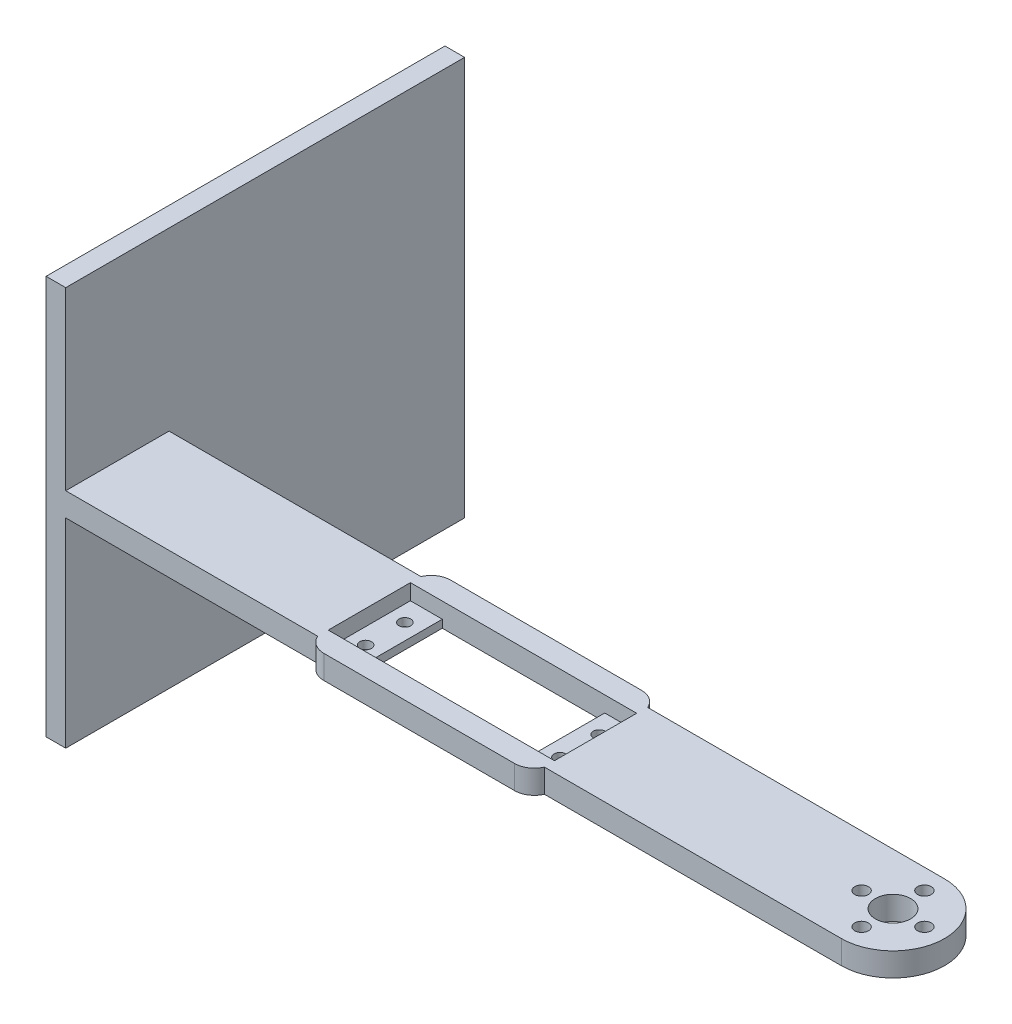
ISO-10303-21;
HEADER;
FILE_DESCRIPTION(('STEP AP214'),'2;1');
FILE_NAME('part.step','',(''),(''),'','','');
FILE_SCHEMA(('AUTOMOTIVE_DESIGN { 1 0 10303 214 1 1 1 1 }'));
ENDSEC;
DATA;
#1=APPLICATION_CONTEXT('core data for automotive mechanical design processes');
#2=APPLICATION_PROTOCOL_DEFINITION('international standard','automotive_design',2000,#1);
#3=PRODUCT_CONTEXT('',#1,'mechanical');
#4=PRODUCT('Part','Part','',(#3));
#5=PRODUCT_RELATED_PRODUCT_CATEGORY('part','',(#4));
#6=PRODUCT_DEFINITION_FORMATION('','',#4);
#7=PRODUCT_DEFINITION_CONTEXT('part definition',#1,'design');
#8=PRODUCT_DEFINITION('design','',#6,#7);
#9=PRODUCT_DEFINITION_SHAPE('','',#8);
#10=(LENGTH_UNIT() NAMED_UNIT(*) SI_UNIT(.MILLI.,.METRE.));
#11=(NAMED_UNIT(*) PLANE_ANGLE_UNIT() SI_UNIT($,.RADIAN.));
#12=(NAMED_UNIT(*) SI_UNIT($,.STERADIAN.) SOLID_ANGLE_UNIT());
#13=UNCERTAINTY_MEASURE_WITH_UNIT(LENGTH_MEASURE(1.E-05),#10,'distance_accuracy_value','');
#14=(GEOMETRIC_REPRESENTATION_CONTEXT(3) GLOBAL_UNCERTAINTY_ASSIGNED_CONTEXT((#13)) GLOBAL_UNIT_ASSIGNED_CONTEXT((#10,
#11,#12)) REPRESENTATION_CONTEXT('',''));
#15=CARTESIAN_POINT('',(0.,0.,0.));
#16=DIRECTION('',(0.,0.,1.));
#17=DIRECTION('',(1.,0.,0.));
#18=AXIS2_PLACEMENT_3D('',#15,#16,#17);
#19=CARTESIAN_POINT('',(0.,6.,-13.1543728715168));
#20=DIRECTION('',(0.,0.,1.));
#21=DIRECTION('',(1.,0.,0.));
#22=AXIS2_PLACEMENT_3D('',#19,#20,#21);
#23=PLANE('',#22);
#24=DIRECTION('',(-1.,0.,0.));
#25=VECTOR('',#24,1.);
#26=CARTESIAN_POINT('',(0.,0.,-13.1543728715168));
#27=LINE('',#26,#25);
#28=CARTESIAN_POINT('',(0.,0.,-13.1543728715169));
#29=VERTEX_POINT('',#28);
#30=CARTESIAN_POINT('',(-75.635048604056,0.,-13.1543728715168));
#31=VERTEX_POINT('',#30);
#32=EDGE_CURVE('E208',#29,#31,#27,.T.);
#33=ORIENTED_EDGE('',*,*,#32,.T.);
#34=DIRECTION('',(0.,1.,0.));
#35=VECTOR('',#34,1.);
#36=CARTESIAN_POINT('',(-75.635048604056,0.,-13.1543728715168));
#37=LINE('',#36,#35);
#38=CARTESIAN_POINT('',(-75.635048604056,6.,-13.1543728715168));
#39=VERTEX_POINT('',#38);
#40=EDGE_CURVE('E215',#31,#39,#37,.T.);
#41=ORIENTED_EDGE('',*,*,#40,.T.);
#42=DIRECTION('',(-1.,0.,0.));
#43=VECTOR('',#42,1.);
#44=CARTESIAN_POINT('',(0.,6.,-13.1543728715168));
#45=LINE('',#44,#43);
#46=CARTESIAN_POINT('',(0.,6.,-13.1543728715169));
#47=VERTEX_POINT('',#46);
#48=EDGE_CURVE('E338',#47,#39,#45,.T.);
#49=ORIENTED_EDGE('',*,*,#48,.F.);
#50=DIRECTION('',(0.,-1.,0.));
#51=VECTOR('',#50,1.);
#52=CARTESIAN_POINT('',(0.,6.,-13.1543728715169));
#53=LINE('',#52,#51);
#54=EDGE_CURVE('E400',#47,#29,#53,.T.);
#55=ORIENTED_EDGE('',*,*,#54,.T.);
#56=EDGE_LOOP('',(#33,#41,#49,#55));
#57=FACE_BOUND('',#56,.T.);
#58=ADVANCED_FACE('F35',(#57),#23,.F.);
#59=CARTESIAN_POINT('',(0.,6.,13.1543728715168));
#60=DIRECTION('',(0.,0.,1.));
#61=DIRECTION('',(1.,0.,0.));
#62=AXIS2_PLACEMENT_3D('',#59,#60,#61);
#63=PLANE('',#62);
#64=DIRECTION('',(-1.,0.,0.));
#65=VECTOR('',#64,1.);
#66=CARTESIAN_POINT('',(0.,6.,13.1543728715168));
#67=LINE('',#66,#65);
#68=CARTESIAN_POINT('',(-133.384001977959,6.,13.1543728715168));
#69=VERTEX_POINT('',#68);
#70=CARTESIAN_POINT('',(-197.55630843939,6.,13.1543728715169));
#71=VERTEX_POINT('',#70);
#72=EDGE_CURVE('E344',#69,#71,#67,.T.);
#73=ORIENTED_EDGE('',*,*,#72,.T.);
#74=DIRECTION('',(0.,1.,0.));
#75=VECTOR('',#74,1.);
#76=CARTESIAN_POINT('',(-197.55630843939,-50.8,13.1543728715169));
#77=LINE('',#76,#75);
#78=CARTESIAN_POINT('',(-197.55630843939,50.8,13.1543728715169));
#79=VERTEX_POINT('',#78);
#80=EDGE_CURVE('E283',#71,#79,#77,.T.);
#81=ORIENTED_EDGE('',*,*,#80,.T.);
#82=DIRECTION('',(-1.,0.,0.));
#83=VECTOR('',#82,1.);
#84=CARTESIAN_POINT('',(0.,50.8,13.1543728715168));
#85=LINE('',#84,#83);
#86=CARTESIAN_POINT('',(-202.55630843939,50.8,13.1543728715169));
#87=VERTEX_POINT('',#86);
#88=EDGE_CURVE('E261',#79,#87,#85,.T.);
#89=ORIENTED_EDGE('',*,*,#88,.T.);
#90=DIRECTION('',(0.,1.,0.));
#91=VECTOR('',#90,1.);
#92=CARTESIAN_POINT('',(-202.55630843939,-50.8,13.1543728715169));
#93=LINE('',#92,#91);
#94=CARTESIAN_POINT('',(-202.55630843939,-50.8,13.1543728715169));
#95=VERTEX_POINT('',#94);
#96=EDGE_CURVE('E284',#95,#87,#93,.T.);
#97=ORIENTED_EDGE('',*,*,#96,.F.);
#98=DIRECTION('',(-1.,0.,0.));
#99=VECTOR('',#98,1.);
#100=CARTESIAN_POINT('',(0.,-50.8,13.1543728715168));
#101=LINE('',#100,#99);
#102=CARTESIAN_POINT('',(-197.55630843939,-50.8,13.1543728715169));
#103=VERTEX_POINT('',#102);
#104=EDGE_CURVE('E271',#103,#95,#101,.T.);
#105=ORIENTED_EDGE('',*,*,#104,.F.);
#106=CARTESIAN_POINT('',(-197.55630843939,0.,13.1543728715169));
#107=VERTEX_POINT('',#106);
#108=EDGE_CURVE('E280',#103,#107,#77,.T.);
#109=ORIENTED_EDGE('',*,*,#108,.T.);
#110=DIRECTION('',(-1.,0.,0.));
#111=VECTOR('',#110,1.);
#112=CARTESIAN_POINT('',(0.,0.,13.1543728715168));
#113=LINE('',#112,#111);
#114=CARTESIAN_POINT('',(-133.384001977959,0.,13.1543728715169));
#115=VERTEX_POINT('',#114);
#116=EDGE_CURVE('E375',#115,#107,#113,.T.);
#117=ORIENTED_EDGE('',*,*,#116,.F.);
#118=DIRECTION('',(0.,-1.,0.));
#119=VECTOR('',#118,1.);
#120=CARTESIAN_POINT('',(-133.384001977959,0.,13.1543728715168));
#121=LINE('',#120,#119);
#122=EDGE_CURVE('E243',#69,#115,#121,.T.);
#123=ORIENTED_EDGE('',*,*,#122,.F.);
#124=EDGE_LOOP('',(#73,#81,#89,#97,#105,#109,#117,#123));
#125=FACE_BOUND('',#124,.T.);
#126=ADVANCED_FACE('F461',(#125),#63,.T.);
#127=CARTESIAN_POINT('',(0.,6.,13.1543728715169));
#128=VERTEX_POINT('',#127);
#129=CARTESIAN_POINT('',(-75.635048604056,6.,13.1543728715168));
#130=VERTEX_POINT('',#129);
#131=EDGE_CURVE('E345',#128,#130,#67,.T.);
#132=ORIENTED_EDGE('',*,*,#131,.T.);
#133=DIRECTION('',(0.,1.,0.));
#134=VECTOR('',#133,1.);
#135=CARTESIAN_POINT('',(-75.635048604056,0.,13.1543728715168));
#136=LINE('',#135,#134);
#137=CARTESIAN_POINT('',(-75.635048604056,0.,13.1543728715168));
#138=VERTEX_POINT('',#137);
#139=EDGE_CURVE('E248',#138,#130,#136,.T.);
#140=ORIENTED_EDGE('',*,*,#139,.F.);
#141=CARTESIAN_POINT('',(0.,0.,13.1543728715169));
#142=VERTEX_POINT('',#141);
#143=EDGE_CURVE('E376',#142,#138,#113,.T.);
#144=ORIENTED_EDGE('',*,*,#143,.F.);
#145=DIRECTION('',(0.,-1.,0.));
#146=VECTOR('',#145,1.);
#147=CARTESIAN_POINT('',(0.,6.,13.1543728715169));
#148=LINE('',#147,#146);
#149=EDGE_CURVE('E370',#128,#142,#148,.T.);
#150=ORIENTED_EDGE('',*,*,#149,.F.);
#151=EDGE_LOOP('',(#132,#140,#144,#150));
#152=FACE_BOUND('',#151,.T.);
#153=ADVANCED_FACE('F445',(#152),#63,.T.);
#154=CARTESIAN_POINT('',(0.,6.,-10.466498315129));
#155=DIRECTION('',(0.,0.,-1.));
#156=DIRECTION('',(-1.,0.,0.));
#157=AXIS2_PLACEMENT_3D('',#154,#155,#156);
#158=PLANE('',#157);
#159=DIRECTION('',(1.,0.,0.));
#160=VECTOR('',#159,1.);
#161=CARTESIAN_POINT('',(0.,0.,-10.466498315129));
#162=LINE('',#161,#160);
#163=CARTESIAN_POINT('',(-125.256924736469,0.,-10.4664983151292));
#164=VERTEX_POINT('',#163);
#165=CARTESIAN_POINT('',(-83.8865174044968,0.,-10.4664983151291));
#166=VERTEX_POINT('',#165);
#167=EDGE_CURVE('E379',#164,#166,#162,.T.);
#168=ORIENTED_EDGE('',*,*,#167,.T.);
#169=DIRECTION('',(0.,-1.,0.));
#170=VECTOR('',#169,1.);
#171=CARTESIAN_POINT('',(-83.8865174044968,2.,-10.4664983151291));
#172=LINE('',#171,#170);
#173=CARTESIAN_POINT('',(-83.8865174044968,2.,-10.4664983151291));
#174=VERTEX_POINT('',#173);
#175=EDGE_CURVE('E301',#174,#166,#172,.T.);
#176=ORIENTED_EDGE('',*,*,#175,.F.);
#177=DIRECTION('',(1.,0.,0.));
#178=VECTOR('',#177,1.);
#179=CARTESIAN_POINT('',(0.,2.,-10.466498315129));
#180=LINE('',#179,#178);
#181=CARTESIAN_POINT('',(-75.7569247364686,2.,-10.4664983151291));
#182=VERTEX_POINT('',#181);
#183=EDGE_CURVE('E296',#174,#182,#180,.T.);
#184=ORIENTED_EDGE('',*,*,#183,.T.);
#185=DIRECTION('',(0.,-1.,0.));
#186=VECTOR('',#185,1.);
#187=CARTESIAN_POINT('',(-75.7569247364686,6.,-10.4664983151291));
#188=LINE('',#187,#186);
#189=CARTESIAN_POINT('',(-75.7569247364686,6.,-10.4664983151291));
#190=VERTEX_POINT('',#189);
#191=EDGE_CURVE('E399',#190,#182,#188,.T.);
#192=ORIENTED_EDGE('',*,*,#191,.F.);
#193=DIRECTION('',(1.,0.,0.));
#194=VECTOR('',#193,1.);
#195=CARTESIAN_POINT('',(0.,6.,-10.466498315129));
#196=LINE('',#195,#194);
#197=CARTESIAN_POINT('',(-133.386517404497,6.,-10.4664983151291));
#198=VERTEX_POINT('',#197);
#199=EDGE_CURVE('E348',#198,#190,#196,.T.);
#200=ORIENTED_EDGE('',*,*,#199,.F.);
#201=DIRECTION('',(0.,-1.,0.));
#202=VECTOR('',#201,1.);
#203=CARTESIAN_POINT('',(-133.386517404497,6.,-10.4664983151291));
#204=LINE('',#203,#202);
#205=CARTESIAN_POINT('',(-133.386517404497,2.,-10.4664983151291));
#206=VERTEX_POINT('',#205);
#207=EDGE_CURVE('E396',#198,#206,#204,.T.);
#208=ORIENTED_EDGE('',*,*,#207,.T.);
#209=DIRECTION('',(-1.,0.,0.));
#210=VECTOR('',#209,1.);
#211=CARTESIAN_POINT('',(0.,2.,-10.4664983151293));
#212=LINE('',#211,#210);
#213=CARTESIAN_POINT('',(-125.256924736469,2.,-10.4664983151292));
#214=VERTEX_POINT('',#213);
#215=EDGE_CURVE('E320',#214,#206,#212,.T.);
#216=ORIENTED_EDGE('',*,*,#215,.F.);
#217=DIRECTION('',(0.,-1.,0.));
#218=VECTOR('',#217,1.);
#219=CARTESIAN_POINT('',(-125.256924736469,2.,-10.4664983151291));
#220=LINE('',#219,#218);
#221=EDGE_CURVE('E325',#214,#164,#220,.T.);
#222=ORIENTED_EDGE('',*,*,#221,.T.);
#223=EDGE_LOOP('',(#168,#176,#184,#192,#200,#208,#216,#222));
#224=FACE_BOUND('',#223,.T.);
#225=ADVANCED_FACE('F520',(#224),#158,.F.);
#226=CARTESIAN_POINT('',(-75.7569247364686,6.,0.));
#227=DIRECTION('',(-1.,0.,0.));
#228=DIRECTION('',(0.,0.,1.));
#229=AXIS2_PLACEMENT_3D('',#226,#227,#228);
#230=PLANE('',#229);
#231=DIRECTION('',(0.,-1.,0.));
#232=VECTOR('',#231,1.);
#233=CARTESIAN_POINT('',(-75.7569247364686,6.,10.4664983151291));
#234=LINE('',#233,#232);
#235=CARTESIAN_POINT('',(-75.7569247364686,6.,10.4664983151291));
#236=VERTEX_POINT('',#235);
#237=CARTESIAN_POINT('',(-75.7569247364686,2.,10.4664983151291));
#238=VERTEX_POINT('',#237);
#239=EDGE_CURVE('E227',#236,#238,#234,.T.);
#240=ORIENTED_EDGE('',*,*,#239,.F.);
#241=DIRECTION('',(0.,0.,-1.));
#242=VECTOR('',#241,1.);
#243=CARTESIAN_POINT('',(-75.7569247364686,6.,0.));
#244=LINE('',#243,#242);
#245=EDGE_CURVE('E351',#236,#190,#244,.T.);
#246=ORIENTED_EDGE('',*,*,#245,.T.);
#247=ORIENTED_EDGE('',*,*,#191,.T.);
#248=DIRECTION('',(0.,0.,-1.));
#249=VECTOR('',#248,1.);
#250=CARTESIAN_POINT('',(-75.7569247364686,2.,0.));
#251=LINE('',#250,#249);
#252=EDGE_CURVE('E294',#238,#182,#251,.T.);
#253=ORIENTED_EDGE('',*,*,#252,.F.);
#254=EDGE_LOOP('',(#240,#246,#247,#253));
#255=FACE_BOUND('',#254,.T.);
#256=ADVANCED_FACE('F516',(#255),#230,.T.);
#257=CARTESIAN_POINT('',(0.,6.,0.));
#258=DIRECTION('',(0.,-1.,0.));
#259=DIRECTION('',(0.,0.,-1.));
#260=AXIS2_PLACEMENT_3D('',#257,#258,#259);
#261=CYLINDRICAL_SURFACE('',#260,13.1543728715169);
#262=CARTESIAN_POINT('',(0.,0.,0.));
#263=DIRECTION('',(0.,1.,0.));
#264=DIRECTION('',(0.,0.,1.));
#265=AXIS2_PLACEMENT_3D('',#262,#263,#264);
#266=CIRCLE('',#265,13.1543728715169);
#267=EDGE_CURVE('E209',#142,#29,#266,.T.);
#268=ORIENTED_EDGE('',*,*,#267,.T.);
#269=ORIENTED_EDGE('',*,*,#54,.F.);
#270=CARTESIAN_POINT('',(0.,6.,0.));
#271=DIRECTION('',(0.,1.,0.));
#272=DIRECTION('',(0.,0.,1.));
#273=AXIS2_PLACEMENT_3D('',#270,#271,#272);
#274=CIRCLE('',#273,13.1543728715169);
#275=EDGE_CURVE('E334',#128,#47,#274,.T.);
#276=ORIENTED_EDGE('',*,*,#275,.F.);
#277=ORIENTED_EDGE('',*,*,#149,.T.);
#278=EDGE_LOOP('',(#268,#269,#276,#277));
#279=FACE_BOUND('',#278,.T.);
#280=ADVANCED_FACE('F506',(#279),#261,.T.);
#281=CARTESIAN_POINT('',(-133.384001977959,6.,-13.1543728715168));
#282=VERTEX_POINT('',#281);
#283=CARTESIAN_POINT('',(-197.55630843939,6.,-13.1543728715168));
#284=VERTEX_POINT('',#283);
#285=EDGE_CURVE('E213',#282,#284,#45,.T.);
#286=ORIENTED_EDGE('',*,*,#285,.F.);
#287=DIRECTION('',(0.,-1.,0.));
#288=VECTOR('',#287,1.);
#289=CARTESIAN_POINT('',(-133.384001977959,0.,-13.1543728715168));
#290=LINE('',#289,#288);
#291=CARTESIAN_POINT('',(-133.384001977959,0.,-13.1543728715168));
#292=VERTEX_POINT('',#291);
#293=EDGE_CURVE('E197',#282,#292,#290,.T.);
#294=ORIENTED_EDGE('',*,*,#293,.T.);
#295=CARTESIAN_POINT('',(-197.55630843939,0.,-13.1543728715168));
#296=VERTEX_POINT('',#295);
#297=EDGE_CURVE('E200',#292,#296,#27,.T.);
#298=ORIENTED_EDGE('',*,*,#297,.T.);
#299=DIRECTION('',(0.,-1.,0.));
#300=VECTOR('',#299,1.);
#301=CARTESIAN_POINT('',(-197.55630843939,6.,-13.1543728715168));
#302=LINE('',#301,#300);
#303=EDGE_CURVE('E405',#284,#296,#302,.T.);
#304=ORIENTED_EDGE('',*,*,#303,.F.);
#305=EDGE_LOOP('',(#286,#294,#298,#304));
#306=FACE_BOUND('',#305,.T.);
#307=ADVANCED_FACE('F212',(#306),#23,.F.);
#308=CARTESIAN_POINT('',(0.,6.,-8.));
#309=DIRECTION('',(0.,-1.,0.));
#310=DIRECTION('',(0.,0.,-1.));
#311=AXIS2_PLACEMENT_3D('',#308,#309,#310);
#312=CYLINDRICAL_SURFACE('',#311,1.75);
#313=CARTESIAN_POINT('',(0.,6.,-8.));
#314=DIRECTION('',(0.,1.,0.));
#315=DIRECTION('',(0.,0.,1.));
#316=AXIS2_PLACEMENT_3D('',#313,#314,#315);
#317=CIRCLE('',#316,1.75);
#318=CARTESIAN_POINT('',(0.,6.,-6.25));
#319=VERTEX_POINT('',#318);
#320=EDGE_CURVE('E364',#319,#319,#317,.T.);
#321=ORIENTED_EDGE('',*,*,#320,.T.);
#322=EDGE_LOOP('',(#321));
#323=FACE_BOUND('',#322,.T.);
#324=CARTESIAN_POINT('',(0.,0.,-8.));
#325=DIRECTION('',(0.,1.,0.));
#326=DIRECTION('',(0.,0.,1.));
#327=AXIS2_PLACEMENT_3D('',#324,#325,#326);
#328=CIRCLE('',#327,1.75);
#329=CARTESIAN_POINT('',(0.,0.,-6.25));
#330=VERTEX_POINT('',#329);
#331=EDGE_CURVE('E391',#330,#330,#328,.T.);
#332=ORIENTED_EDGE('',*,*,#331,.F.);
#333=EDGE_LOOP('',(#332));
#334=FACE_BOUND('',#333,.T.);
#335=ADVANCED_FACE('F505',(#323,#334),#312,.F.);
#336=CARTESIAN_POINT('',(-8.,6.,0.));
#337=DIRECTION('',(0.,-1.,0.));
#338=DIRECTION('',(0.,0.,-1.));
#339=AXIS2_PLACEMENT_3D('',#336,#337,#338);
#340=CYLINDRICAL_SURFACE('',#339,1.75);
#341=CARTESIAN_POINT('',(-8.,6.,0.));
#342=DIRECTION('',(0.,1.,0.));
#343=DIRECTION('',(0.,0.,1.));
#344=AXIS2_PLACEMENT_3D('',#341,#342,#343);
#345=CIRCLE('',#344,1.75);
#346=CARTESIAN_POINT('',(-8.,6.,1.75));
#347=VERTEX_POINT('',#346);
#348=EDGE_CURVE('E361',#347,#347,#345,.T.);
#349=ORIENTED_EDGE('',*,*,#348,.T.);
#350=EDGE_LOOP('',(#349));
#351=FACE_BOUND('',#350,.T.);
#352=CARTESIAN_POINT('',(-8.,0.,0.));
#353=DIRECTION('',(0.,1.,0.));
#354=DIRECTION('',(0.,0.,1.));
#355=AXIS2_PLACEMENT_3D('',#352,#353,#354);
#356=CIRCLE('',#355,1.75);
#357=CARTESIAN_POINT('',(-8.,0.,1.75));
#358=VERTEX_POINT('',#357);
#359=EDGE_CURVE('E388',#358,#358,#356,.T.);
#360=ORIENTED_EDGE('',*,*,#359,.F.);
#361=EDGE_LOOP('',(#360));
#362=FACE_BOUND('',#361,.T.);
#363=ADVANCED_FACE('F512',(#351,#362),#340,.F.);
#364=CARTESIAN_POINT('',(0.,6.,0.));
#365=DIRECTION('',(0.,-1.,0.));
#366=DIRECTION('',(0.,0.,-1.));
#367=AXIS2_PLACEMENT_3D('',#364,#365,#366);
#368=CYLINDRICAL_SURFACE('',#367,4.5);
#369=CARTESIAN_POINT('',(0.,6.,0.));
#370=DIRECTION('',(0.,1.,0.));
#371=DIRECTION('',(0.,0.,1.));
#372=AXIS2_PLACEMENT_3D('',#369,#370,#371);
#373=CIRCLE('',#372,4.5);
#374=CARTESIAN_POINT('',(0.,6.,4.5));
#375=VERTEX_POINT('',#374);
#376=EDGE_CURVE('E358',#375,#375,#373,.T.);
#377=ORIENTED_EDGE('',*,*,#376,.T.);
#378=EDGE_LOOP('',(#377));
#379=FACE_BOUND('',#378,.T.);
#380=CARTESIAN_POINT('',(0.,0.,0.));
#381=DIRECTION('',(0.,1.,0.));
#382=DIRECTION('',(0.,0.,1.));
#383=AXIS2_PLACEMENT_3D('',#380,#381,#382);
#384=CIRCLE('',#383,4.5);
#385=CARTESIAN_POINT('',(0.,0.,4.5));
#386=VERTEX_POINT('',#385);
#387=EDGE_CURVE('E385',#386,#386,#384,.T.);
#388=ORIENTED_EDGE('',*,*,#387,.F.);
#389=EDGE_LOOP('',(#388));
#390=FACE_BOUND('',#389,.T.);
#391=ADVANCED_FACE('F816',(#379,#390),#368,.F.);
#392=CARTESIAN_POINT('',(0.,6.,8.));
#393=DIRECTION('',(0.,-1.,0.));
#394=DIRECTION('',(0.,0.,-1.));
#395=AXIS2_PLACEMENT_3D('',#392,#393,#394);
#396=CYLINDRICAL_SURFACE('',#395,1.75);
#397=CARTESIAN_POINT('',(0.,6.,8.));
#398=DIRECTION('',(0.,1.,0.));
#399=DIRECTION('',(0.,0.,1.));
#400=AXIS2_PLACEMENT_3D('',#397,#398,#399);
#401=CIRCLE('',#400,1.75);
#402=CARTESIAN_POINT('',(0.,6.,9.75));
#403=VERTEX_POINT('',#402);
#404=EDGE_CURVE('E355',#403,#403,#401,.T.);
#405=ORIENTED_EDGE('',*,*,#404,.T.);
#406=EDGE_LOOP('',(#405));
#407=FACE_BOUND('',#406,.T.);
#408=CARTESIAN_POINT('',(0.,0.,8.));
#409=DIRECTION('',(0.,1.,0.));
#410=DIRECTION('',(0.,0.,1.));
#411=AXIS2_PLACEMENT_3D('',#408,#409,#410);
#412=CIRCLE('',#411,1.75);
#413=CARTESIAN_POINT('',(0.,0.,9.75));
#414=VERTEX_POINT('',#413);
#415=EDGE_CURVE('E382',#414,#414,#412,.T.);
#416=ORIENTED_EDGE('',*,*,#415,.F.);
#417=EDGE_LOOP('',(#416));
#418=FACE_BOUND('',#417,.T.);
#419=ADVANCED_FACE('F807',(#407,#418),#396,.F.);
#420=CARTESIAN_POINT('',(-133.386517404497,6.,0.));
#421=DIRECTION('',(-1.,0.,0.));
#422=DIRECTION('',(0.,0.,1.));
#423=AXIS2_PLACEMENT_3D('',#420,#421,#422);
#424=PLANE('',#423);
#425=DIRECTION('',(0.,0.,-1.));
#426=VECTOR('',#425,1.);
#427=CARTESIAN_POINT('',(-133.386517404497,6.,0.));
#428=LINE('',#427,#426);
#429=CARTESIAN_POINT('',(-133.386517404497,6.,10.4664983151291));
#430=VERTEX_POINT('',#429);
#431=EDGE_CURVE('E353',#430,#198,#428,.T.);
#432=ORIENTED_EDGE('',*,*,#431,.F.);
#433=DIRECTION('',(0.,-1.,0.));
#434=VECTOR('',#433,1.);
#435=CARTESIAN_POINT('',(-133.386517404497,6.,10.4664983151291));
#436=LINE('',#435,#434);
#437=CARTESIAN_POINT('',(-133.386517404497,2.,10.4664983151291));
#438=VERTEX_POINT('',#437);
#439=EDGE_CURVE('E233',#430,#438,#436,.T.);
#440=ORIENTED_EDGE('',*,*,#439,.T.);
#441=DIRECTION('',(0.,0.,-1.));
#442=VECTOR('',#441,1.);
#443=CARTESIAN_POINT('',(-133.386517404497,2.,0.));
#444=LINE('',#443,#442);
#445=EDGE_CURVE('E323',#438,#206,#444,.T.);
#446=ORIENTED_EDGE('',*,*,#445,.T.);
#447=ORIENTED_EDGE('',*,*,#207,.F.);
#448=EDGE_LOOP('',(#432,#440,#446,#447));
#449=FACE_BOUND('',#448,.T.);
#450=ADVANCED_FACE('F801',(#449),#424,.F.);
#451=CARTESIAN_POINT('',(8.,6.,0.));
#452=DIRECTION('',(0.,-1.,0.));
#453=DIRECTION('',(0.,0.,-1.));
#454=AXIS2_PLACEMENT_3D('',#451,#452,#453);
#455=CYLINDRICAL_SURFACE('',#454,1.75);
#456=CARTESIAN_POINT('',(8.,6.,0.));
#457=DIRECTION('',(0.,1.,0.));
#458=DIRECTION('',(0.,0.,1.));
#459=AXIS2_PLACEMENT_3D('',#456,#457,#458);
#460=CIRCLE('',#459,1.75);
#461=CARTESIAN_POINT('',(8.,6.,1.75));
#462=VERTEX_POINT('',#461);
#463=EDGE_CURVE('E367',#462,#462,#460,.T.);
#464=ORIENTED_EDGE('',*,*,#463,.T.);
#465=EDGE_LOOP('',(#464));
#466=FACE_BOUND('',#465,.T.);
#467=CARTESIAN_POINT('',(8.,0.,0.));
#468=DIRECTION('',(0.,1.,0.));
#469=DIRECTION('',(0.,0.,1.));
#470=AXIS2_PLACEMENT_3D('',#467,#468,#469);
#471=CIRCLE('',#470,1.75);
#472=CARTESIAN_POINT('',(8.,0.,1.75));
#473=VERTEX_POINT('',#472);
#474=EDGE_CURVE('E337',#473,#473,#471,.T.);
#475=ORIENTED_EDGE('',*,*,#474,.F.);
#476=EDGE_LOOP('',(#475));
#477=FACE_BOUND('',#476,.T.);
#478=ADVANCED_FACE('F579',(#466,#477),#455,.F.);
#479=CARTESIAN_POINT('',(0.,6.,0.));
#480=DIRECTION('',(0.,1.,0.));
#481=DIRECTION('',(0.,0.,1.));
#482=AXIS2_PLACEMENT_3D('',#479,#480,#481);
#483=PLANE('',#482);
#484=ORIENTED_EDGE('',*,*,#245,.F.);
#485=DIRECTION('',(1.,0.,0.));
#486=VECTOR('',#485,1.);
#487=CARTESIAN_POINT('',(0.,6.,10.466498315129));
#488=LINE('',#487,#486);
#489=EDGE_CURVE('E224',#430,#236,#488,.T.);
#490=ORIENTED_EDGE('',*,*,#489,.F.);
#491=ORIENTED_EDGE('',*,*,#431,.T.);
#492=ORIENTED_EDGE('',*,*,#199,.T.);
#493=EDGE_LOOP('',(#484,#490,#491,#492));
#494=FACE_BOUND('',#493,.T.);
#495=ORIENTED_EDGE('',*,*,#48,.T.);
#496=CARTESIAN_POINT('',(-80.2176242990118,6.,-11.1543728715168));
#497=DIRECTION('',(0.,1.,0.));
#498=DIRECTION('',(0.,0.,1.));
#499=AXIS2_PLACEMENT_3D('',#496,#497,#498);
#500=CIRCLE('',#499,5.);
#501=CARTESIAN_POINT('',(-80.2176242990118,6.,-16.1543728715168));
#502=VERTEX_POINT('',#501);
#503=EDGE_CURVE('E427',#39,#502,#500,.T.);
#504=ORIENTED_EDGE('',*,*,#503,.T.);
#505=DIRECTION('',(-1.,0.,0.));
#506=VECTOR('',#505,1.);
#507=CARTESIAN_POINT('',(-133.384001977959,6.,-16.1543728715168));
#508=LINE('',#507,#506);
#509=CARTESIAN_POINT('',(-128.801426283003,6.,-16.1543728715168));
#510=VERTEX_POINT('',#509);
#511=EDGE_CURVE('E214',#502,#510,#508,.T.);
#512=ORIENTED_EDGE('',*,*,#511,.T.);
#513=CARTESIAN_POINT('',(-128.801426283003,6.,-11.1543728715168));
#514=DIRECTION('',(0.,1.,0.));
#515=DIRECTION('',(0.,0.,1.));
#516=AXIS2_PLACEMENT_3D('',#513,#514,#515);
#517=CIRCLE('',#516,5.);
#518=EDGE_CURVE('E425',#510,#282,#517,.T.);
#519=ORIENTED_EDGE('',*,*,#518,.T.);
#520=ORIENTED_EDGE('',*,*,#285,.T.);
#521=DIRECTION('',(0.,0.,-1.));
#522=VECTOR('',#521,1.);
#523=CARTESIAN_POINT('',(-197.55630843939,6.,1.07938760969173E-13));
#524=LINE('',#523,#522);
#525=EDGE_CURVE('E341',#71,#284,#524,.T.);
#526=ORIENTED_EDGE('',*,*,#525,.F.);
#527=ORIENTED_EDGE('',*,*,#72,.F.);
#528=CARTESIAN_POINT('',(-128.801426283003,6.,11.1543728715168));
#529=DIRECTION('',(0.,1.,0.));
#530=DIRECTION('',(0.,0.,1.));
#531=AXIS2_PLACEMENT_3D('',#528,#529,#530);
#532=CIRCLE('',#531,5.);
#533=CARTESIAN_POINT('',(-128.801426283003,6.,16.1543728715168));
#534=VERTEX_POINT('',#533);
#535=EDGE_CURVE('E414',#69,#534,#532,.T.);
#536=ORIENTED_EDGE('',*,*,#535,.T.);
#537=DIRECTION('',(-1.,0.,0.));
#538=VECTOR('',#537,1.);
#539=CARTESIAN_POINT('',(-133.384001977959,6.,16.1543728715168));
#540=LINE('',#539,#538);
#541=CARTESIAN_POINT('',(-80.2176242990118,6.,16.1543728715168));
#542=VERTEX_POINT('',#541);
#543=EDGE_CURVE('E244',#542,#534,#540,.T.);
#544=ORIENTED_EDGE('',*,*,#543,.F.);
#545=CARTESIAN_POINT('',(-80.2176242990118,6.,11.1543728715168));
#546=DIRECTION('',(0.,1.,0.));
#547=DIRECTION('',(0.,0.,1.));
#548=AXIS2_PLACEMENT_3D('',#545,#546,#547);
#549=CIRCLE('',#548,5.);
#550=EDGE_CURVE('E416',#542,#130,#549,.T.);
#551=ORIENTED_EDGE('',*,*,#550,.T.);
#552=ORIENTED_EDGE('',*,*,#131,.F.);
#553=ORIENTED_EDGE('',*,*,#275,.T.);
#554=EDGE_LOOP('',(#495,#504,#512,#519,#520,#526,#527,#536,#544,#551,#552,#553));
#555=FACE_BOUND('',#554,.T.);
#556=ORIENTED_EDGE('',*,*,#404,.F.);
#557=EDGE_LOOP('',(#556));
#558=FACE_BOUND('',#557,.T.);
#559=ORIENTED_EDGE('',*,*,#376,.F.);
#560=EDGE_LOOP('',(#559));
#561=FACE_BOUND('',#560,.T.);
#562=ORIENTED_EDGE('',*,*,#348,.F.);
#563=EDGE_LOOP('',(#562));
#564=FACE_BOUND('',#563,.T.);
#565=ORIENTED_EDGE('',*,*,#320,.F.);
#566=EDGE_LOOP('',(#565));
#567=FACE_BOUND('',#566,.T.);
#568=ORIENTED_EDGE('',*,*,#463,.F.);
#569=EDGE_LOOP('',(#568));
#570=FACE_BOUND('',#569,.T.);
#571=ADVANCED_FACE('F432',(#494,#555,#558,#561,#564,#567,#570),#483,.T.);
#572=CARTESIAN_POINT('',(0.,0.,0.));
#573=DIRECTION('',(0.,1.,0.));
#574=DIRECTION('',(0.,0.,1.));
#575=AXIS2_PLACEMENT_3D('',#572,#573,#574);
#576=PLANE('',#575);
#577=DIRECTION('',(1.,0.,0.));
#578=VECTOR('',#577,1.);
#579=CARTESIAN_POINT('',(0.,0.,10.466498315129));
#580=LINE('',#579,#578);
#581=CARTESIAN_POINT('',(-125.256924736469,0.,10.4664983151291));
#582=VERTEX_POINT('',#581);
#583=CARTESIAN_POINT('',(-83.8865174044968,0.,10.4664983151291));
#584=VERTEX_POINT('',#583);
#585=EDGE_CURVE('E228',#582,#584,#580,.T.);
#586=ORIENTED_EDGE('',*,*,#585,.T.);
#587=DIRECTION('',(0.,0.,-1.));
#588=VECTOR('',#587,1.);
#589=CARTESIAN_POINT('',(-83.8865174044968,0.,0.));
#590=LINE('',#589,#588);
#591=EDGE_CURVE('E291',#584,#166,#590,.T.);
#592=ORIENTED_EDGE('',*,*,#591,.T.);
#593=ORIENTED_EDGE('',*,*,#167,.F.);
#594=DIRECTION('',(0.,0.,-1.));
#595=VECTOR('',#594,1.);
#596=CARTESIAN_POINT('',(-125.256924736469,0.,0.));
#597=LINE('',#596,#595);
#598=EDGE_CURVE('E315',#582,#164,#597,.T.);
#599=ORIENTED_EDGE('',*,*,#598,.F.);
#600=EDGE_LOOP('',(#586,#592,#593,#599));
#601=FACE_BOUND('',#600,.T.);
#602=DIRECTION('',(1.,0.,0.));
#603=VECTOR('',#602,1.);
#604=CARTESIAN_POINT('',(-133.384001977959,0.,-16.1543728715168));
#605=LINE('',#604,#603);
#606=CARTESIAN_POINT('',(-128.801426283003,0.,-16.1543728715168));
#607=VERTEX_POINT('',#606);
#608=CARTESIAN_POINT('',(-80.2176242990118,0.,-16.1543728715168));
#609=VERTEX_POINT('',#608);
#610=EDGE_CURVE('E218',#607,#609,#605,.T.);
#611=ORIENTED_EDGE('',*,*,#610,.T.);
#612=CARTESIAN_POINT('',(-80.2176242990118,0.,-11.1543728715168));
#613=DIRECTION('',(0.,1.,0.));
#614=DIRECTION('',(0.,0.,1.));
#615=AXIS2_PLACEMENT_3D('',#612,#613,#614);
#616=CIRCLE('',#615,5.);
#617=EDGE_CURVE('E11',#609,#31,#616,.F.);
#618=ORIENTED_EDGE('',*,*,#617,.T.);
#619=ORIENTED_EDGE('',*,*,#32,.F.);
#620=ORIENTED_EDGE('',*,*,#267,.F.);
#621=ORIENTED_EDGE('',*,*,#143,.T.);
#622=CARTESIAN_POINT('',(-80.2176242990118,0.,11.1543728715168));
#623=DIRECTION('',(0.,1.,0.));
#624=DIRECTION('',(0.,0.,1.));
#625=AXIS2_PLACEMENT_3D('',#622,#623,#624);
#626=CIRCLE('',#625,5.);
#627=CARTESIAN_POINT('',(-80.2176242990118,0.,16.1543728715168));
#628=VERTEX_POINT('',#627);
#629=EDGE_CURVE('E420',#138,#628,#626,.F.);
#630=ORIENTED_EDGE('',*,*,#629,.T.);
#631=DIRECTION('',(1.,0.,0.));
#632=VECTOR('',#631,1.);
#633=CARTESIAN_POINT('',(-133.384001977959,0.,16.1543728715168));
#634=LINE('',#633,#632);
#635=CARTESIAN_POINT('',(-128.801426283003,0.,16.1543728715168));
#636=VERTEX_POINT('',#635);
#637=EDGE_CURVE('E247',#636,#628,#634,.T.);
#638=ORIENTED_EDGE('',*,*,#637,.F.);
#639=CARTESIAN_POINT('',(-128.801426283003,0.,11.1543728715168));
#640=DIRECTION('',(0.,1.,0.));
#641=DIRECTION('',(0.,0.,1.));
#642=AXIS2_PLACEMENT_3D('',#639,#640,#641);
#643=CIRCLE('',#642,5.);
#644=EDGE_CURVE('E418',#636,#115,#643,.F.);
#645=ORIENTED_EDGE('',*,*,#644,.T.);
#646=ORIENTED_EDGE('',*,*,#116,.T.);
#647=DIRECTION('',(0.,0.,-1.));
#648=VECTOR('',#647,1.);
#649=CARTESIAN_POINT('',(-197.55630843939,0.,1.07938760969173E-13));
#650=LINE('',#649,#648);
#651=EDGE_CURVE('E204',#107,#296,#650,.T.);
#652=ORIENTED_EDGE('',*,*,#651,.T.);
#653=ORIENTED_EDGE('',*,*,#297,.F.);
#654=CARTESIAN_POINT('',(-128.801426283003,0.,-11.1543728715168));
#655=DIRECTION('',(0.,1.,0.));
#656=DIRECTION('',(0.,0.,1.));
#657=AXIS2_PLACEMENT_3D('',#654,#655,#656);
#658=CIRCLE('',#657,5.);
#659=EDGE_CURVE('E43',#292,#607,#658,.F.);
#660=ORIENTED_EDGE('',*,*,#659,.T.);
#661=EDGE_LOOP('',(#611,#618,#619,#620,#621,#630,#638,#645,#646,#652,#653,#660));
#662=FACE_BOUND('',#661,.T.);
#663=ORIENTED_EDGE('',*,*,#415,.T.);
#664=EDGE_LOOP('',(#663));
#665=FACE_BOUND('',#664,.T.);
#666=ORIENTED_EDGE('',*,*,#387,.T.);
#667=EDGE_LOOP('',(#666));
#668=FACE_BOUND('',#667,.T.);
#669=ORIENTED_EDGE('',*,*,#359,.T.);
#670=EDGE_LOOP('',(#669));
#671=FACE_BOUND('',#670,.T.);
#672=ORIENTED_EDGE('',*,*,#331,.T.);
#673=EDGE_LOOP('',(#672));
#674=FACE_BOUND('',#673,.T.);
#675=ORIENTED_EDGE('',*,*,#474,.T.);
#676=EDGE_LOOP('',(#675));
#677=FACE_BOUND('',#676,.T.);
#678=CARTESIAN_POINT('',(-79.8217210704827,0.,-5.));
#679=DIRECTION('',(0.,1.,0.));
#680=DIRECTION('',(0.,0.,1.));
#681=AXIS2_PLACEMENT_3D('',#678,#679,#680);
#682=CIRCLE('',#681,1.5);
#683=CARTESIAN_POINT('',(-79.8217210704827,0.,-3.5));
#684=VERTEX_POINT('',#683);
#685=EDGE_CURVE('E304',#684,#684,#682,.T.);
#686=ORIENTED_EDGE('',*,*,#685,.T.);
#687=EDGE_LOOP('',(#686));
#688=FACE_BOUND('',#687,.T.);
#689=CARTESIAN_POINT('',(-79.8217210704827,0.,5.));
#690=DIRECTION('',(0.,1.,0.));
#691=DIRECTION('',(0.,0.,1.));
#692=AXIS2_PLACEMENT_3D('',#689,#690,#691);
#693=CIRCLE('',#692,1.5);
#694=CARTESIAN_POINT('',(-79.8217210704827,0.,6.5));
#695=VERTEX_POINT('',#694);
#696=EDGE_CURVE('E279',#695,#695,#693,.T.);
#697=ORIENTED_EDGE('',*,*,#696,.T.);
#698=EDGE_LOOP('',(#697));
#699=FACE_BOUND('',#698,.T.);
#700=CARTESIAN_POINT('',(-129.321721070483,0.,-5.));
#701=DIRECTION('',(0.,1.,0.));
#702=DIRECTION('',(0.,0.,1.));
#703=AXIS2_PLACEMENT_3D('',#700,#701,#702);
#704=CIRCLE('',#703,1.5);
#705=CARTESIAN_POINT('',(-129.321721070483,0.,-3.5));
#706=VERTEX_POINT('',#705);
#707=EDGE_CURVE('E328',#706,#706,#704,.T.);
#708=ORIENTED_EDGE('',*,*,#707,.T.);
#709=EDGE_LOOP('',(#708));
#710=FACE_BOUND('',#709,.T.);
#711=CARTESIAN_POINT('',(-129.321721070483,0.,5.));
#712=DIRECTION('',(0.,1.,0.));
#713=DIRECTION('',(0.,0.,1.));
#714=AXIS2_PLACEMENT_3D('',#711,#712,#713);
#715=CIRCLE('',#714,1.5);
#716=CARTESIAN_POINT('',(-129.321721070483,0.,6.5));
#717=VERTEX_POINT('',#716);
#718=EDGE_CURVE('E310',#717,#717,#715,.T.);
#719=ORIENTED_EDGE('',*,*,#718,.T.);
#720=EDGE_LOOP('',(#719));
#721=FACE_BOUND('',#720,.T.);
#722=ADVANCED_FACE('F201',(#601,#662,#665,#668,#671,#674,#677,#688,#699,#710,#721),#576,.F.);
#723=CARTESIAN_POINT('',(-125.256924736469,2.,0.));
#724=DIRECTION('',(-1.,0.,0.));
#725=DIRECTION('',(0.,0.,1.));
#726=AXIS2_PLACEMENT_3D('',#723,#724,#725);
#727=PLANE('',#726);
#728=DIRECTION('',(0.,0.,-1.));
#729=VECTOR('',#728,1.);
#730=CARTESIAN_POINT('',(-125.256924736469,2.,0.));
#731=LINE('',#730,#729);
#732=CARTESIAN_POINT('',(-125.256924736469,2.,10.4664983151292));
#733=VERTEX_POINT('',#732);
#734=EDGE_CURVE('E318',#733,#214,#731,.T.);
#735=ORIENTED_EDGE('',*,*,#734,.F.);
#736=DIRECTION('',(0.,-1.,0.));
#737=VECTOR('',#736,1.);
#738=CARTESIAN_POINT('',(-125.256924736469,2.,10.4664983151292));
#739=LINE('',#738,#737);
#740=EDGE_CURVE('E241',#733,#582,#739,.T.);
#741=ORIENTED_EDGE('',*,*,#740,.T.);
#742=ORIENTED_EDGE('',*,*,#598,.T.);
#743=ORIENTED_EDGE('',*,*,#221,.F.);
#744=EDGE_LOOP('',(#735,#741,#742,#743));
#745=FACE_BOUND('',#744,.T.);
#746=ADVANCED_FACE('F586',(#745),#727,.F.);
#747=CARTESIAN_POINT('',(-129.321721070483,2.,-5.));
#748=DIRECTION('',(0.,-1.,0.));
#749=DIRECTION('',(0.,0.,-1.));
#750=AXIS2_PLACEMENT_3D('',#747,#748,#749);
#751=CYLINDRICAL_SURFACE('',#750,1.5);
#752=CARTESIAN_POINT('',(-129.321721070483,2.,-5.));
#753=DIRECTION('',(0.,1.,0.));
#754=DIRECTION('',(0.,0.,1.));
#755=AXIS2_PLACEMENT_3D('',#752,#753,#754);
#756=CIRCLE('',#755,1.5);
#757=CARTESIAN_POINT('',(-129.321721070483,2.,-3.5));
#758=VERTEX_POINT('',#757);
#759=EDGE_CURVE('E314',#758,#758,#756,.T.);
#760=ORIENTED_EDGE('',*,*,#759,.T.);
#761=EDGE_LOOP('',(#760));
#762=FACE_BOUND('',#761,.T.);
#763=ORIENTED_EDGE('',*,*,#707,.F.);
#764=EDGE_LOOP('',(#763));
#765=FACE_BOUND('',#764,.T.);
#766=ADVANCED_FACE('F704',(#762,#765),#751,.F.);
#767=CARTESIAN_POINT('',(-129.321721070483,2.,5.));
#768=DIRECTION('',(0.,-1.,0.));
#769=DIRECTION('',(0.,0.,-1.));
#770=AXIS2_PLACEMENT_3D('',#767,#768,#769);
#771=CYLINDRICAL_SURFACE('',#770,1.5);
#772=CARTESIAN_POINT('',(-129.321721070483,2.,5.));
#773=DIRECTION('',(0.,1.,0.));
#774=DIRECTION('',(0.,0.,1.));
#775=AXIS2_PLACEMENT_3D('',#772,#773,#774);
#776=CIRCLE('',#775,1.5);
#777=CARTESIAN_POINT('',(-129.321721070483,2.,6.5));
#778=VERTEX_POINT('',#777);
#779=EDGE_CURVE('E311',#778,#778,#776,.T.);
#780=ORIENTED_EDGE('',*,*,#779,.T.);
#781=EDGE_LOOP('',(#780));
#782=FACE_BOUND('',#781,.T.);
#783=ORIENTED_EDGE('',*,*,#718,.F.);
#784=EDGE_LOOP('',(#783));
#785=FACE_BOUND('',#784,.T.);
#786=ADVANCED_FACE('F709',(#782,#785),#771,.F.);
#787=CARTESIAN_POINT('',(0.,2.,0.));
#788=DIRECTION('',(0.,1.,0.));
#789=DIRECTION('',(0.,0.,1.));
#790=AXIS2_PLACEMENT_3D('',#787,#788,#789);
#791=PLANE('',#790);
#792=DIRECTION('',(-1.,0.,0.));
#793=VECTOR('',#792,1.);
#794=CARTESIAN_POINT('',(0.,2.,10.466498315129));
#795=LINE('',#794,#793);
#796=EDGE_CURVE('E238',#733,#438,#795,.T.);
#797=ORIENTED_EDGE('',*,*,#796,.F.);
#798=ORIENTED_EDGE('',*,*,#734,.T.);
#799=ORIENTED_EDGE('',*,*,#215,.T.);
#800=ORIENTED_EDGE('',*,*,#445,.F.);
#801=EDGE_LOOP('',(#797,#798,#799,#800));
#802=FACE_BOUND('',#801,.T.);
#803=ORIENTED_EDGE('',*,*,#779,.F.);
#804=EDGE_LOOP('',(#803));
#805=FACE_BOUND('',#804,.T.);
#806=ORIENTED_EDGE('',*,*,#759,.F.);
#807=EDGE_LOOP('',(#806));
#808=FACE_BOUND('',#807,.T.);
#809=ADVANCED_FACE('F720',(#802,#805,#808),#791,.T.);
#810=CARTESIAN_POINT('',(-79.8217210704827,2.,-5.));
#811=DIRECTION('',(0.,-1.,0.));
#812=DIRECTION('',(0.,0.,-1.));
#813=AXIS2_PLACEMENT_3D('',#810,#811,#812);
#814=CYLINDRICAL_SURFACE('',#813,1.5);
#815=CARTESIAN_POINT('',(-79.8217210704827,2.,-5.));
#816=DIRECTION('',(0.,1.,0.));
#817=DIRECTION('',(0.,0.,1.));
#818=AXIS2_PLACEMENT_3D('',#815,#816,#817);
#819=CIRCLE('',#818,1.5);
#820=CARTESIAN_POINT('',(-79.8217210704827,2.,-3.5));
#821=VERTEX_POINT('',#820);
#822=EDGE_CURVE('E290',#821,#821,#819,.T.);
#823=ORIENTED_EDGE('',*,*,#822,.T.);
#824=EDGE_LOOP('',(#823));
#825=FACE_BOUND('',#824,.T.);
#826=ORIENTED_EDGE('',*,*,#685,.F.);
#827=EDGE_LOOP('',(#826));
#828=FACE_BOUND('',#827,.T.);
#829=ADVANCED_FACE('F728',(#825,#828),#814,.F.);
#830=CARTESIAN_POINT('',(-79.8217210704827,2.,5.));
#831=DIRECTION('',(0.,-1.,0.));
#832=DIRECTION('',(0.,0.,-1.));
#833=AXIS2_PLACEMENT_3D('',#830,#831,#832);
#834=CYLINDRICAL_SURFACE('',#833,1.5);
#835=CARTESIAN_POINT('',(-79.8217210704827,2.,5.));
#836=DIRECTION('',(0.,1.,0.));
#837=DIRECTION('',(0.,0.,1.));
#838=AXIS2_PLACEMENT_3D('',#835,#836,#837);
#839=CIRCLE('',#838,1.5);
#840=CARTESIAN_POINT('',(-79.8217210704827,2.,6.5));
#841=VERTEX_POINT('',#840);
#842=EDGE_CURVE('E287',#841,#841,#839,.T.);
#843=ORIENTED_EDGE('',*,*,#842,.T.);
#844=EDGE_LOOP('',(#843));
#845=FACE_BOUND('',#844,.T.);
#846=ORIENTED_EDGE('',*,*,#696,.F.);
#847=EDGE_LOOP('',(#846));
#848=FACE_BOUND('',#847,.T.);
#849=ADVANCED_FACE('F733',(#845,#848),#834,.F.);
#850=CARTESIAN_POINT('',(-83.8865174044968,2.,0.));
#851=DIRECTION('',(-1.,0.,0.));
#852=DIRECTION('',(0.,0.,1.));
#853=AXIS2_PLACEMENT_3D('',#850,#851,#852);
#854=PLANE('',#853);
#855=DIRECTION('',(0.,-1.,0.));
#856=VECTOR('',#855,1.);
#857=CARTESIAN_POINT('',(-83.8865174044968,2.,10.4664983151291));
#858=LINE('',#857,#856);
#859=CARTESIAN_POINT('',(-83.8865174044968,2.,10.4664983151291));
#860=VERTEX_POINT('',#859);
#861=EDGE_CURVE('E235',#860,#584,#858,.T.);
#862=ORIENTED_EDGE('',*,*,#861,.F.);
#863=DIRECTION('',(0.,0.,-1.));
#864=VECTOR('',#863,1.);
#865=CARTESIAN_POINT('',(-83.8865174044968,2.,0.));
#866=LINE('',#865,#864);
#867=EDGE_CURVE('E299',#860,#174,#866,.T.);
#868=ORIENTED_EDGE('',*,*,#867,.T.);
#869=ORIENTED_EDGE('',*,*,#175,.T.);
#870=ORIENTED_EDGE('',*,*,#591,.F.);
#871=EDGE_LOOP('',(#862,#868,#869,#870));
#872=FACE_BOUND('',#871,.T.);
#873=ADVANCED_FACE('F743',(#872),#854,.T.);
#874=CARTESIAN_POINT('',(0.,2.,0.));
#875=DIRECTION('',(0.,1.,0.));
#876=DIRECTION('',(0.,0.,1.));
#877=AXIS2_PLACEMENT_3D('',#874,#875,#876);
#878=PLANE('',#877);
#879=DIRECTION('',(-1.,0.,0.));
#880=VECTOR('',#879,1.);
#881=CARTESIAN_POINT('',(0.,2.,10.466498315129));
#882=LINE('',#881,#880);
#883=EDGE_CURVE('E422',#238,#860,#882,.T.);
#884=ORIENTED_EDGE('',*,*,#883,.F.);
#885=ORIENTED_EDGE('',*,*,#252,.T.);
#886=ORIENTED_EDGE('',*,*,#183,.F.);
#887=ORIENTED_EDGE('',*,*,#867,.F.);
#888=EDGE_LOOP('',(#884,#885,#886,#887));
#889=FACE_BOUND('',#888,.T.);
#890=ORIENTED_EDGE('',*,*,#842,.F.);
#891=EDGE_LOOP('',(#890));
#892=FACE_BOUND('',#891,.T.);
#893=ORIENTED_EDGE('',*,*,#822,.F.);
#894=EDGE_LOOP('',(#893));
#895=FACE_BOUND('',#894,.T.);
#896=ADVANCED_FACE('F493',(#889,#892,#895),#878,.T.);
#897=CARTESIAN_POINT('',(-197.55630843939,-50.8,1.07938760969173E-13));
#898=DIRECTION('',(1.,0.,0.));
#899=DIRECTION('',(0.,0.,-1.));
#900=AXIS2_PLACEMENT_3D('',#897,#898,#899);
#901=PLANE('',#900);
#902=ORIENTED_EDGE('',*,*,#651,.F.);
#903=ORIENTED_EDGE('',*,*,#108,.F.);
#904=DIRECTION('',(0.,0.,-1.));
#905=VECTOR('',#904,1.);
#906=CARTESIAN_POINT('',(-197.55630843939,-50.8,1.07938760969173E-13));
#907=LINE('',#906,#905);
#908=CARTESIAN_POINT('',(-197.55630843939,-50.8,-88.4456271284832));
#909=VERTEX_POINT('',#908);
#910=EDGE_CURVE('E273',#103,#909,#907,.T.);
#911=ORIENTED_EDGE('',*,*,#910,.T.);
#912=DIRECTION('',(0.,1.,0.));
#913=VECTOR('',#912,1.);
#914=CARTESIAN_POINT('',(-197.55630843939,-50.8,-88.4456271284832));
#915=LINE('',#914,#913);
#916=CARTESIAN_POINT('',(-197.55630843939,50.8,-88.4456271284832));
#917=VERTEX_POINT('',#916);
#918=EDGE_CURVE('E277',#909,#917,#915,.T.);
#919=ORIENTED_EDGE('',*,*,#918,.T.);
#920=DIRECTION('',(0.,0.,-1.));
#921=VECTOR('',#920,1.);
#922=CARTESIAN_POINT('',(-197.55630843939,50.8,1.07938760969173E-13));
#923=LINE('',#922,#921);
#924=EDGE_CURVE('E264',#79,#917,#923,.T.);
#925=ORIENTED_EDGE('',*,*,#924,.F.);
#926=ORIENTED_EDGE('',*,*,#80,.F.);
#927=ORIENTED_EDGE('',*,*,#525,.T.);
#928=ORIENTED_EDGE('',*,*,#303,.T.);
#929=EDGE_LOOP('',(#902,#903,#911,#919,#925,#926,#927,#928));
#930=FACE_BOUND('',#929,.T.);
#931=ADVANCED_FACE('F467',(#930),#901,.T.);
#932=CARTESIAN_POINT('',(0.,-50.8,-88.4456271284832));
#933=DIRECTION('',(0.,0.,1.));
#934=DIRECTION('',(1.,0.,0.));
#935=AXIS2_PLACEMENT_3D('',#932,#933,#934);
#936=PLANE('',#935);
#937=DIRECTION('',(0.,1.,0.));
#938=VECTOR('',#937,1.);
#939=CARTESIAN_POINT('',(-202.55630843939,-50.8,-88.4456271284832));
#940=LINE('',#939,#938);
#941=CARTESIAN_POINT('',(-202.55630843939,-50.8,-88.4456271284832));
#942=VERTEX_POINT('',#941);
#943=CARTESIAN_POINT('',(-202.55630843939,50.8,-88.4456271284832));
#944=VERTEX_POINT('',#943);
#945=EDGE_CURVE('E276',#942,#944,#940,.T.);
#946=ORIENTED_EDGE('',*,*,#945,.T.);
#947=DIRECTION('',(1.,0.,0.));
#948=VECTOR('',#947,1.);
#949=CARTESIAN_POINT('',(0.,50.8,-88.4456271284832));
#950=LINE('',#949,#948);
#951=EDGE_CURVE('E251',#944,#917,#950,.T.);
#952=ORIENTED_EDGE('',*,*,#951,.T.);
#953=ORIENTED_EDGE('',*,*,#918,.F.);
#954=DIRECTION('',(1.,0.,0.));
#955=VECTOR('',#954,1.);
#956=CARTESIAN_POINT('',(0.,-50.8,-88.4456271284832));
#957=LINE('',#956,#955);
#958=EDGE_CURVE('E267',#942,#909,#957,.T.);
#959=ORIENTED_EDGE('',*,*,#958,.F.);
#960=EDGE_LOOP('',(#946,#952,#953,#959));
#961=FACE_BOUND('',#960,.T.);
#962=ADVANCED_FACE('F485',(#961),#936,.F.);
#963=CARTESIAN_POINT('',(-202.55630843939,-50.8,1.10670608962837E-13));
#964=DIRECTION('',(1.,0.,0.));
#965=DIRECTION('',(0.,0.,-1.));
#966=AXIS2_PLACEMENT_3D('',#963,#964,#965);
#967=PLANE('',#966);
#968=ORIENTED_EDGE('',*,*,#96,.T.);
#969=DIRECTION('',(0.,0.,-1.));
#970=VECTOR('',#969,1.);
#971=CARTESIAN_POINT('',(-202.55630843939,50.8,1.10670608962837E-13));
#972=LINE('',#971,#970);
#973=EDGE_CURVE('E258',#87,#944,#972,.T.);
#974=ORIENTED_EDGE('',*,*,#973,.T.);
#975=ORIENTED_EDGE('',*,*,#945,.F.);
#976=DIRECTION('',(0.,0.,-1.));
#977=VECTOR('',#976,1.);
#978=CARTESIAN_POINT('',(-202.55630843939,-50.8,1.10670608962837E-13));
#979=LINE('',#978,#977);
#980=EDGE_CURVE('E269',#95,#942,#979,.T.);
#981=ORIENTED_EDGE('',*,*,#980,.F.);
#982=EDGE_LOOP('',(#968,#974,#975,#981));
#983=FACE_BOUND('',#982,.T.);
#984=ADVANCED_FACE('F479',(#983),#967,.F.);
#985=CARTESIAN_POINT('',(0.,-50.8,0.));
#986=DIRECTION('',(0.,1.,0.));
#987=DIRECTION('',(0.,0.,1.));
#988=AXIS2_PLACEMENT_3D('',#985,#986,#987);
#989=PLANE('',#988);
#990=ORIENTED_EDGE('',*,*,#958,.T.);
#991=ORIENTED_EDGE('',*,*,#910,.F.);
#992=ORIENTED_EDGE('',*,*,#104,.T.);
#993=ORIENTED_EDGE('',*,*,#980,.T.);
#994=EDGE_LOOP('',(#990,#991,#992,#993));
#995=FACE_BOUND('',#994,.T.);
#996=ADVANCED_FACE('F483',(#995),#989,.F.);
#997=CARTESIAN_POINT('',(0.,50.8,0.));
#998=DIRECTION('',(0.,1.,0.));
#999=DIRECTION('',(0.,0.,1.));
#1000=AXIS2_PLACEMENT_3D('',#997,#998,#999);
#1001=PLANE('',#1000);
#1002=ORIENTED_EDGE('',*,*,#951,.F.);
#1003=ORIENTED_EDGE('',*,*,#973,.F.);
#1004=ORIENTED_EDGE('',*,*,#88,.F.);
#1005=ORIENTED_EDGE('',*,*,#924,.T.);
#1006=EDGE_LOOP('',(#1002,#1003,#1004,#1005));
#1007=FACE_BOUND('',#1006,.T.);
#1008=ADVANCED_FACE('F476',(#1007),#1001,.T.);
#1009=CARTESIAN_POINT('',(0.,0.,16.1543728715168));
#1010=DIRECTION('',(0.,0.,1.));
#1011=DIRECTION('',(1.,0.,0.));
#1012=AXIS2_PLACEMENT_3D('',#1009,#1010,#1011);
#1013=PLANE('',#1012);
#1014=ORIENTED_EDGE('',*,*,#637,.T.);
#1015=DIRECTION('',(0.,-1.,0.));
#1016=VECTOR('',#1015,1.);
#1017=CARTESIAN_POINT('',(-80.2176242990118,6.,16.1543728715168));
#1018=LINE('',#1017,#1016);
#1019=EDGE_CURVE('E411',#628,#542,#1018,.F.);
#1020=ORIENTED_EDGE('',*,*,#1019,.T.);
#1021=ORIENTED_EDGE('',*,*,#543,.T.);
#1022=DIRECTION('',(0.,1.,0.));
#1023=VECTOR('',#1022,1.);
#1024=CARTESIAN_POINT('',(-128.801426283003,0.,16.1543728715168));
#1025=LINE('',#1024,#1023);
#1026=EDGE_CURVE('E403',#534,#636,#1025,.F.);
#1027=ORIENTED_EDGE('',*,*,#1026,.T.);
#1028=EDGE_LOOP('',(#1014,#1020,#1021,#1027));
#1029=FACE_BOUND('',#1028,.T.);
#1030=ADVANCED_FACE('F453',(#1029),#1013,.T.);
#1031=CARTESIAN_POINT('',(-80.2176242990118,0.,11.1543728715168));
#1032=DIRECTION('',(0.,1.,0.));
#1033=DIRECTION('',(0.,0.,1.));
#1034=AXIS2_PLACEMENT_3D('',#1031,#1032,#1033);
#1035=CYLINDRICAL_SURFACE('',#1034,5.);
#1036=ORIENTED_EDGE('',*,*,#629,.F.);
#1037=ORIENTED_EDGE('',*,*,#139,.T.);
#1038=ORIENTED_EDGE('',*,*,#550,.F.);
#1039=ORIENTED_EDGE('',*,*,#1019,.F.);
#1040=EDGE_LOOP('',(#1036,#1037,#1038,#1039));
#1041=FACE_BOUND('',#1040,.T.);
#1042=ADVANCED_FACE('F449',(#1041),#1035,.T.);
#1043=CARTESIAN_POINT('',(-128.801426283003,0.,11.1543728715168));
#1044=DIRECTION('',(0.,-1.,0.));
#1045=DIRECTION('',(0.,0.,-1.));
#1046=AXIS2_PLACEMENT_3D('',#1043,#1044,#1045);
#1047=CYLINDRICAL_SURFACE('',#1046,5.);
#1048=ORIENTED_EDGE('',*,*,#535,.F.);
#1049=ORIENTED_EDGE('',*,*,#122,.T.);
#1050=ORIENTED_EDGE('',*,*,#644,.F.);
#1051=ORIENTED_EDGE('',*,*,#1026,.F.);
#1052=EDGE_LOOP('',(#1048,#1049,#1050,#1051));
#1053=FACE_BOUND('',#1052,.T.);
#1054=ADVANCED_FACE('F458',(#1053),#1047,.T.);
#1055=CARTESIAN_POINT('',(0.,6.,10.466498315129));
#1056=DIRECTION('',(0.,0.,-1.));
#1057=DIRECTION('',(-1.,0.,0.));
#1058=AXIS2_PLACEMENT_3D('',#1055,#1056,#1057);
#1059=PLANE('',#1058);
#1060=ORIENTED_EDGE('',*,*,#740,.F.);
#1061=ORIENTED_EDGE('',*,*,#796,.T.);
#1062=ORIENTED_EDGE('',*,*,#439,.F.);
#1063=ORIENTED_EDGE('',*,*,#489,.T.);
#1064=ORIENTED_EDGE('',*,*,#239,.T.);
#1065=ORIENTED_EDGE('',*,*,#883,.T.);
#1066=ORIENTED_EDGE('',*,*,#861,.T.);
#1067=ORIENTED_EDGE('',*,*,#585,.F.);
#1068=EDGE_LOOP('',(#1060,#1061,#1062,#1063,#1064,#1065,#1066,#1067));
#1069=FACE_BOUND('',#1068,.T.);
#1070=ADVANCED_FACE('F527',(#1069),#1059,.T.);
#1071=CARTESIAN_POINT('',(0.,0.,-16.1543728715168));
#1072=DIRECTION('',(0.,0.,-1.));
#1073=DIRECTION('',(1.,0.,0.));
#1074=AXIS2_PLACEMENT_3D('',#1071,#1072,#1073);
#1075=PLANE('',#1074);
#1076=ORIENTED_EDGE('',*,*,#511,.F.);
#1077=DIRECTION('',(0.,1.,0.));
#1078=VECTOR('',#1077,1.);
#1079=CARTESIAN_POINT('',(-80.2176242990118,0.,-16.1543728715168));
#1080=LINE('',#1079,#1078);
#1081=EDGE_CURVE('E50',#502,#609,#1080,.F.);
#1082=ORIENTED_EDGE('',*,*,#1081,.T.);
#1083=ORIENTED_EDGE('',*,*,#610,.F.);
#1084=DIRECTION('',(0.,-1.,0.));
#1085=VECTOR('',#1084,1.);
#1086=CARTESIAN_POINT('',(-128.801426283003,6.,-16.1543728715168));
#1087=LINE('',#1086,#1085);
#1088=EDGE_CURVE('E198',#607,#510,#1087,.F.);
#1089=ORIENTED_EDGE('',*,*,#1088,.T.);
#1090=EDGE_LOOP('',(#1076,#1082,#1083,#1089));
#1091=FACE_BOUND('',#1090,.T.);
#1092=ADVANCED_FACE('F430',(#1091),#1075,.T.);
#1093=CARTESIAN_POINT('',(-80.2176242990118,0.,-11.1543728715168));
#1094=DIRECTION('',(0.,-1.,0.));
#1095=DIRECTION('',(0.,0.,-1.));
#1096=AXIS2_PLACEMENT_3D('',#1093,#1094,#1095);
#1097=CYLINDRICAL_SURFACE('',#1096,5.);
#1098=ORIENTED_EDGE('',*,*,#617,.F.);
#1099=ORIENTED_EDGE('',*,*,#1081,.F.);
#1100=ORIENTED_EDGE('',*,*,#503,.F.);
#1101=ORIENTED_EDGE('',*,*,#40,.F.);
#1102=EDGE_LOOP('',(#1098,#1099,#1100,#1101));
#1103=FACE_BOUND('',#1102,.T.);
#1104=ADVANCED_FACE('F437',(#1103),#1097,.T.);
#1105=CARTESIAN_POINT('',(-128.801426283003,0.,-11.1543728715168));
#1106=DIRECTION('',(0.,1.,0.));
#1107=DIRECTION('',(0.,0.,1.));
#1108=AXIS2_PLACEMENT_3D('',#1105,#1106,#1107);
#1109=CYLINDRICAL_SURFACE('',#1108,5.);
#1110=ORIENTED_EDGE('',*,*,#518,.F.);
#1111=ORIENTED_EDGE('',*,*,#1088,.F.);
#1112=ORIENTED_EDGE('',*,*,#659,.F.);
#1113=ORIENTED_EDGE('',*,*,#293,.F.);
#1114=EDGE_LOOP('',(#1110,#1111,#1112,#1113));
#1115=FACE_BOUND('',#1114,.T.);
#1116=ADVANCED_FACE('F37',(#1115),#1109,.T.);
#1117=CLOSED_SHELL('',(#58,#126,#153,#225,#256,#280,#307,#335,#363,#391,#419,#450,#478,#571,
#722,#746,#766,#786,#809,#829,#849,#873,#896,#931,#962,#984,#996,#1008,#1030,#1042,#1054,#1070,
#1092,#1104,#1116));
#1118=MANIFOLD_SOLID_BREP('B2',#1117);
#1119=ADVANCED_BREP_SHAPE_REPRESENTATION('',(#18,#1118),#14);
#1120=SHAPE_DEFINITION_REPRESENTATION(#9,#1119);
ENDSEC;
END-ISO-10303-21;
